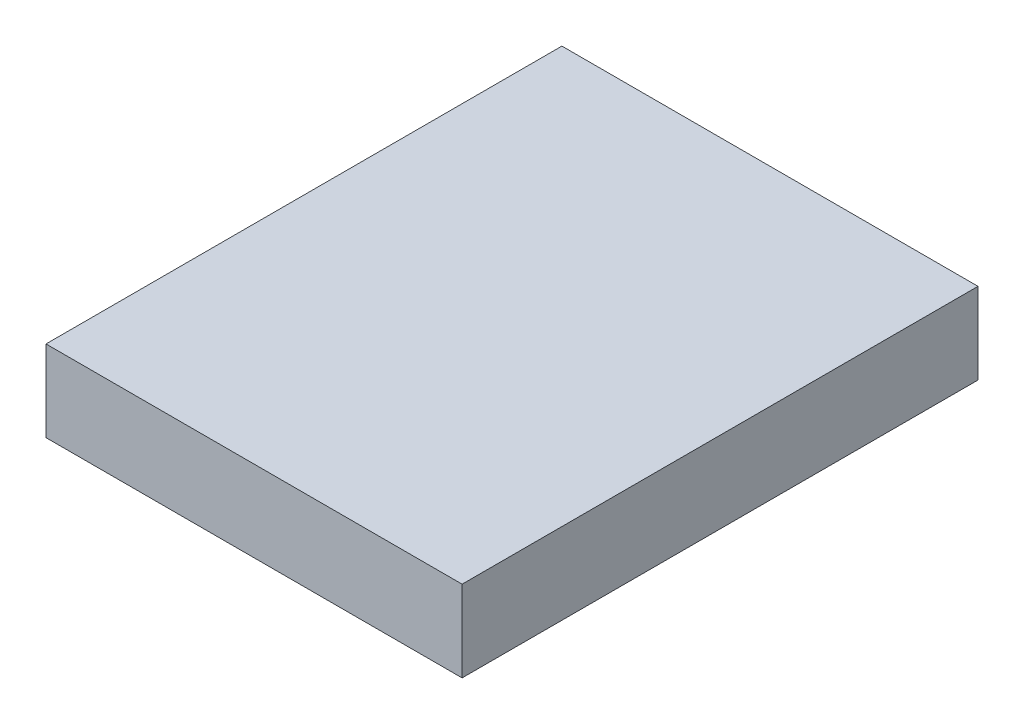
ISO-10303-21;
HEADER;
FILE_DESCRIPTION(('STEP AP214'),'2;1');
FILE_NAME('part.step','',(''),(''),'','','');
FILE_SCHEMA(('AUTOMOTIVE_DESIGN { 1 0 10303 214 1 1 1 1 }'));
ENDSEC;
DATA;
#1=APPLICATION_CONTEXT('core data for automotive mechanical design processes');
#2=APPLICATION_PROTOCOL_DEFINITION('international standard','automotive_design',2000,#1);
#3=PRODUCT_CONTEXT('',#1,'mechanical');
#4=PRODUCT('Part','Part','',(#3));
#5=PRODUCT_RELATED_PRODUCT_CATEGORY('part','',(#4));
#6=PRODUCT_DEFINITION_FORMATION('','',#4);
#7=PRODUCT_DEFINITION_CONTEXT('part definition',#1,'design');
#8=PRODUCT_DEFINITION('design','',#6,#7);
#9=PRODUCT_DEFINITION_SHAPE('','',#8);
#10=(LENGTH_UNIT() NAMED_UNIT(*) SI_UNIT(.MILLI.,.METRE.));
#11=(NAMED_UNIT(*) PLANE_ANGLE_UNIT() SI_UNIT($,.RADIAN.));
#12=(NAMED_UNIT(*) SI_UNIT($,.STERADIAN.) SOLID_ANGLE_UNIT());
#13=UNCERTAINTY_MEASURE_WITH_UNIT(LENGTH_MEASURE(1.E-05),#10,'distance_accuracy_value','');
#14=(GEOMETRIC_REPRESENTATION_CONTEXT(3) GLOBAL_UNCERTAINTY_ASSIGNED_CONTEXT((#13)) GLOBAL_UNIT_ASSIGNED_CONTEXT((#10,
#11,#12)) REPRESENTATION_CONTEXT('',''));
#15=CARTESIAN_POINT('',(0.,0.,0.));
#16=DIRECTION('',(0.,0.,1.));
#17=DIRECTION('',(1.,0.,0.));
#18=AXIS2_PLACEMENT_3D('',#15,#16,#17);
#19=CARTESIAN_POINT('',(0.,2.41,-8.315));
#20=DIRECTION('',(0.,1.,0.));
#21=DIRECTION('',(0.,0.,1.));
#22=AXIS2_PLACEMENT_3D('',#19,#20,#21);
#23=PLANE('',#22);
#24=DIRECTION('',(0.,0.,-1.));
#25=VECTOR('',#24,1.);
#26=CARTESIAN_POINT('',(6.15,2.41,-0.69));
#27=LINE('',#26,#25);
#28=CARTESIAN_POINT('',(6.15,2.41,-0.690000000000001));
#29=VERTEX_POINT('',#28);
#30=CARTESIAN_POINT('',(6.15,2.41,-15.94));
#31=VERTEX_POINT('',#30);
#32=EDGE_CURVE('E79',#29,#31,#27,.T.);
#33=ORIENTED_EDGE('',*,*,#32,.F.);
#34=DIRECTION('',(1.,0.,0.));
#35=VECTOR('',#34,1.);
#36=CARTESIAN_POINT('',(-6.15,2.41,-0.690000000000001));
#37=LINE('',#36,#35);
#38=CARTESIAN_POINT('',(-6.15,2.41,-0.690000000000001));
#39=VERTEX_POINT('',#38);
#40=EDGE_CURVE('E55',#39,#29,#37,.T.);
#41=ORIENTED_EDGE('',*,*,#40,.F.);
#42=DIRECTION('',(0.,0.,1.));
#43=VECTOR('',#42,1.);
#44=CARTESIAN_POINT('',(-6.15,2.41,-15.94));
#45=LINE('',#44,#43);
#46=CARTESIAN_POINT('',(-6.15,2.41,-15.94));
#47=VERTEX_POINT('',#46);
#48=EDGE_CURVE('E57',#47,#39,#45,.T.);
#49=ORIENTED_EDGE('',*,*,#48,.F.);
#50=DIRECTION('',(-1.,0.,0.));
#51=VECTOR('',#50,1.);
#52=CARTESIAN_POINT('',(6.15,2.41,-15.94));
#53=LINE('',#52,#51);
#54=EDGE_CURVE('E20',#31,#47,#53,.T.);
#55=ORIENTED_EDGE('',*,*,#54,.F.);
#56=EDGE_LOOP('',(#33,#41,#49,#55));
#57=FACE_BOUND('',#56,.T.);
#58=ADVANCED_FACE('F17',(#57),#23,.F.);
#59=CARTESIAN_POINT('',(6.15,2.41,-15.94));
#60=DIRECTION('',(0.,0.,-1.));
#61=DIRECTION('',(-1.,0.,0.));
#62=AXIS2_PLACEMENT_3D('',#59,#60,#61);
#63=PLANE('',#62);
#64=DIRECTION('',(1.,0.,0.));
#65=VECTOR('',#64,1.);
#66=CARTESIAN_POINT('',(0.,4.81,-15.94));
#67=LINE('',#66,#65);
#68=CARTESIAN_POINT('',(6.15,4.81,-15.94));
#69=VERTEX_POINT('',#68);
#70=CARTESIAN_POINT('',(-6.15,4.81,-15.94));
#71=VERTEX_POINT('',#70);
#72=EDGE_CURVE('E83',#69,#71,#67,.F.);
#73=ORIENTED_EDGE('',*,*,#72,.F.);
#74=DIRECTION('',(0.,1.,0.));
#75=VECTOR('',#74,1.);
#76=CARTESIAN_POINT('',(6.15,2.41,-15.94));
#77=LINE('',#76,#75);
#78=EDGE_CURVE('E68',#31,#69,#77,.T.);
#79=ORIENTED_EDGE('',*,*,#78,.F.);
#80=ORIENTED_EDGE('',*,*,#54,.T.);
#81=DIRECTION('',(0.,1.,0.));
#82=VECTOR('',#81,1.);
#83=CARTESIAN_POINT('',(-6.15,2.41,-15.94));
#84=LINE('',#83,#82);
#85=EDGE_CURVE('E63',#71,#47,#84,.F.);
#86=ORIENTED_EDGE('',*,*,#85,.F.);
#87=EDGE_LOOP('',(#73,#79,#80,#86));
#88=FACE_BOUND('',#87,.T.);
#89=ADVANCED_FACE('F65',(#88),#63,.T.);
#90=CARTESIAN_POINT('',(-6.15,2.41,-15.94));
#91=DIRECTION('',(-1.,0.,0.));
#92=DIRECTION('',(0.,0.,1.));
#93=AXIS2_PLACEMENT_3D('',#90,#91,#92);
#94=PLANE('',#93);
#95=DIRECTION('',(0.,0.,1.));
#96=VECTOR('',#95,1.);
#97=CARTESIAN_POINT('',(-6.15,4.81,-8.315));
#98=LINE('',#97,#96);
#99=CARTESIAN_POINT('',(-6.15,4.81,-0.690000000000001));
#100=VERTEX_POINT('',#99);
#101=EDGE_CURVE('E72',#71,#100,#98,.T.);
#102=ORIENTED_EDGE('',*,*,#101,.F.);
#103=ORIENTED_EDGE('',*,*,#85,.T.);
#104=ORIENTED_EDGE('',*,*,#48,.T.);
#105=DIRECTION('',(0.,1.,0.));
#106=VECTOR('',#105,1.);
#107=CARTESIAN_POINT('',(-6.15,2.41,-0.690000000000001));
#108=LINE('',#107,#106);
#109=EDGE_CURVE('E75',#100,#39,#108,.F.);
#110=ORIENTED_EDGE('',*,*,#109,.F.);
#111=EDGE_LOOP('',(#102,#103,#104,#110));
#112=FACE_BOUND('',#111,.T.);
#113=ADVANCED_FACE('F70',(#112),#94,.T.);
#114=CARTESIAN_POINT('',(-6.15,2.41,-0.690000000000001));
#115=DIRECTION('',(0.,0.,1.));
#116=DIRECTION('',(1.,0.,0.));
#117=AXIS2_PLACEMENT_3D('',#114,#115,#116);
#118=PLANE('',#117);
#119=DIRECTION('',(1.,0.,0.));
#120=VECTOR('',#119,1.);
#121=CARTESIAN_POINT('',(0.,4.81,-0.69));
#122=LINE('',#121,#120);
#123=CARTESIAN_POINT('',(6.15,4.81,-0.690000000000001));
#124=VERTEX_POINT('',#123);
#125=EDGE_CURVE('E26',#100,#124,#122,.T.);
#126=ORIENTED_EDGE('',*,*,#125,.F.);
#127=ORIENTED_EDGE('',*,*,#109,.T.);
#128=ORIENTED_EDGE('',*,*,#40,.T.);
#129=DIRECTION('',(0.,1.,0.));
#130=VECTOR('',#129,1.);
#131=CARTESIAN_POINT('',(6.15,2.41,-0.69));
#132=LINE('',#131,#130);
#133=EDGE_CURVE('E35',#124,#29,#132,.F.);
#134=ORIENTED_EDGE('',*,*,#133,.F.);
#135=EDGE_LOOP('',(#126,#127,#128,#134));
#136=FACE_BOUND('',#135,.T.);
#137=ADVANCED_FACE('F89',(#136),#118,.T.);
#138=CARTESIAN_POINT('',(6.15,2.41,-0.69));
#139=DIRECTION('',(1.,0.,0.));
#140=DIRECTION('',(0.,0.,-1.));
#141=AXIS2_PLACEMENT_3D('',#138,#139,#140);
#142=PLANE('',#141);
#143=DIRECTION('',(0.,0.,1.));
#144=VECTOR('',#143,1.);
#145=CARTESIAN_POINT('',(6.15,4.81,-8.315));
#146=LINE('',#145,#144);
#147=EDGE_CURVE('E11',#124,#69,#146,.F.);
#148=ORIENTED_EDGE('',*,*,#147,.F.);
#149=ORIENTED_EDGE('',*,*,#133,.T.);
#150=ORIENTED_EDGE('',*,*,#32,.T.);
#151=ORIENTED_EDGE('',*,*,#78,.T.);
#152=EDGE_LOOP('',(#148,#149,#150,#151));
#153=FACE_BOUND('',#152,.T.);
#154=ADVANCED_FACE('F91',(#153),#142,.T.);
#155=CARTESIAN_POINT('',(0.,4.81,-8.315));
#156=DIRECTION('',(0.,1.,0.));
#157=DIRECTION('',(0.,0.,1.));
#158=AXIS2_PLACEMENT_3D('',#155,#156,#157);
#159=PLANE('',#158);
#160=ORIENTED_EDGE('',*,*,#125,.T.);
#161=ORIENTED_EDGE('',*,*,#147,.T.);
#162=ORIENTED_EDGE('',*,*,#72,.T.);
#163=ORIENTED_EDGE('',*,*,#101,.T.);
#164=EDGE_LOOP('',(#160,#161,#162,#163));
#165=FACE_BOUND('',#164,.T.);
#166=ADVANCED_FACE('F88',(#165),#159,.T.);
#167=CLOSED_SHELL('',(#58,#89,#113,#137,#154,#166));
#168=MANIFOLD_SOLID_BREP('B1',#167);
#169=ADVANCED_BREP_SHAPE_REPRESENTATION('',(#18,#168),#14);
#170=SHAPE_DEFINITION_REPRESENTATION(#9,#169);
ENDSEC;
END-ISO-10303-21;
